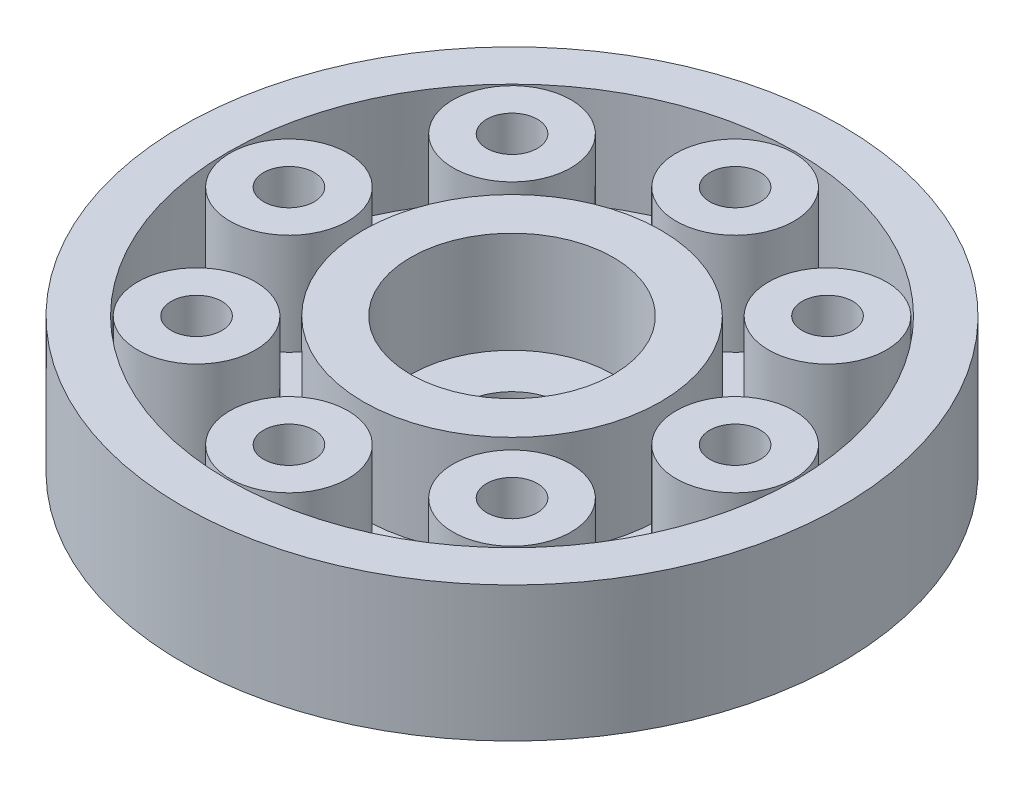
ISO-10303-21;
HEADER;
FILE_DESCRIPTION(('STEP AP214'),'2;1');
FILE_NAME('part.step','',(''),(''),'','','');
FILE_SCHEMA(('AUTOMOTIVE_DESIGN { 1 0 10303 214 1 1 1 1 }'));
ENDSEC;
DATA;
#1=APPLICATION_CONTEXT('core data for automotive mechanical design processes');
#2=APPLICATION_PROTOCOL_DEFINITION('international standard','automotive_design',2000,#1);
#3=PRODUCT_CONTEXT('',#1,'mechanical');
#4=PRODUCT('Part','Part','',(#3));
#5=PRODUCT_RELATED_PRODUCT_CATEGORY('part','',(#4));
#6=PRODUCT_DEFINITION_FORMATION('','',#4);
#7=PRODUCT_DEFINITION_CONTEXT('part definition',#1,'design');
#8=PRODUCT_DEFINITION('design','',#6,#7);
#9=PRODUCT_DEFINITION_SHAPE('','',#8);
#10=(LENGTH_UNIT() NAMED_UNIT(*) SI_UNIT(.MILLI.,.METRE.));
#11=(NAMED_UNIT(*) PLANE_ANGLE_UNIT() SI_UNIT($,.RADIAN.));
#12=(NAMED_UNIT(*) SI_UNIT($,.STERADIAN.) SOLID_ANGLE_UNIT());
#13=UNCERTAINTY_MEASURE_WITH_UNIT(LENGTH_MEASURE(1.E-05),#10,'distance_accuracy_value','');
#14=(GEOMETRIC_REPRESENTATION_CONTEXT(3) GLOBAL_UNCERTAINTY_ASSIGNED_CONTEXT((#13)) GLOBAL_UNIT_ASSIGNED_CONTEXT((#10,
#11,#12)) REPRESENTATION_CONTEXT('',''));
#15=CARTESIAN_POINT('',(0.,0.,0.));
#16=DIRECTION('',(0.,0.,1.));
#17=DIRECTION('',(1.,0.,0.));
#18=AXIS2_PLACEMENT_3D('',#15,#16,#17);
#19=CARTESIAN_POINT('',(0.394660743405106,3.,0.591991115107673));
#20=DIRECTION('',(0.,1.,0.));
#21=DIRECTION('',(0.,0.,1.));
#22=AXIS2_PLACEMENT_3D('',#19,#20,#21);
#23=PLANE('',#22);
#24=CARTESIAN_POINT('',(0.394660743405106,3.,0.591991115107673));
#25=DIRECTION('',(0.,1.,0.));
#26=DIRECTION('',(0.,0.,1.));
#27=AXIS2_PLACEMENT_3D('',#24,#25,#26);
#28=CIRCLE('',#27,4.4);
#29=CARTESIAN_POINT('',(0.394660743405106,3.,4.99199111510767));
#30=VERTEX_POINT('',#29);
#31=EDGE_CURVE('E54',#30,#30,#28,.T.);
#32=ORIENTED_EDGE('',*,*,#31,.T.);
#33=EDGE_LOOP('',(#32));
#34=FACE_BOUND('',#33,.T.);
#35=CARTESIAN_POINT('',(0.394660743405106,3.,0.591991115107673));
#36=DIRECTION('',(0.,1.,0.));
#37=DIRECTION('',(0.,0.,1.));
#38=AXIS2_PLACEMENT_3D('',#35,#36,#37);
#39=CIRCLE('',#38,3.);
#40=CARTESIAN_POINT('',(0.394660743405106,3.,3.59199111510767));
#41=VERTEX_POINT('',#40);
#42=EDGE_CURVE('E99',#41,#41,#39,.T.);
#43=ORIENTED_EDGE('',*,*,#42,.F.);
#44=EDGE_LOOP('',(#43));
#45=FACE_BOUND('',#44,.T.);
#46=ADVANCED_FACE('F38',(#34,#45),#23,.T.);
#47=CARTESIAN_POINT('',(0.394660743405106,3.,0.591991115107673));
#48=DIRECTION('',(0.,1.,0.));
#49=DIRECTION('',(0.,0.,1.));
#50=AXIS2_PLACEMENT_3D('',#47,#48,#49);
#51=CIRCLE('',#50,8.4);
#52=CARTESIAN_POINT('',(0.394660743405106,3.,8.99199111510768));
#53=VERTEX_POINT('',#52);
#54=EDGE_CURVE('E42',#53,#53,#51,.T.);
#55=ORIENTED_EDGE('',*,*,#54,.F.);
#56=EDGE_LOOP('',(#55));
#57=FACE_BOUND('',#56,.T.);
#58=CARTESIAN_POINT('',(0.394660743405106,3.,0.591991115107673));
#59=DIRECTION('',(0.,1.,0.));
#60=DIRECTION('',(0.,0.,1.));
#61=AXIS2_PLACEMENT_3D('',#58,#59,#60);
#62=CIRCLE('',#61,9.75);
#63=CARTESIAN_POINT('',(0.394660743405106,3.,10.3419911151077));
#64=VERTEX_POINT('',#63);
#65=EDGE_CURVE('E10',#64,#64,#62,.T.);
#66=ORIENTED_EDGE('',*,*,#65,.T.);
#67=EDGE_LOOP('',(#66));
#68=FACE_BOUND('',#67,.T.);
#69=ADVANCED_FACE('F88',(#57,#68),#23,.T.);
#70=CARTESIAN_POINT('',(0.394660743405106,3.,0.591991115107673));
#71=DIRECTION('',(0.,-1.,0.));
#72=DIRECTION('',(0.,0.,-1.));
#73=AXIS2_PLACEMENT_3D('',#70,#71,#72);
#74=CYLINDRICAL_SURFACE('',#73,9.75);
#75=ORIENTED_EDGE('',*,*,#65,.F.);
#76=EDGE_LOOP('',(#75));
#77=FACE_BOUND('',#76,.T.);
#78=CARTESIAN_POINT('',(0.394660743405106,-1.,0.591991115107673));
#79=DIRECTION('',(0.,-1.,0.));
#80=DIRECTION('',(0.,0.,-1.));
#81=AXIS2_PLACEMENT_3D('',#78,#79,#80);
#82=CIRCLE('',#81,9.75);
#83=CARTESIAN_POINT('',(0.394660743405106,-1.,-9.15800888489233));
#84=VERTEX_POINT('',#83);
#85=EDGE_CURVE('E46',#84,#84,#82,.T.);
#86=ORIENTED_EDGE('',*,*,#85,.F.);
#87=EDGE_LOOP('',(#86));
#88=FACE_BOUND('',#87,.T.);
#89=ADVANCED_FACE('F40',(#77,#88),#74,.T.);
#90=CARTESIAN_POINT('',(0.394660743405106,0.,0.591991115107673));
#91=DIRECTION('',(0.,-1.,0.));
#92=DIRECTION('',(0.,0.,-1.));
#93=AXIS2_PLACEMENT_3D('',#90,#91,#92);
#94=PLANE('',#93);
#95=CARTESIAN_POINT('',(0.394660743405106,0.,0.591991115107673));
#96=DIRECTION('',(0.,1.,0.));
#97=DIRECTION('',(0.,0.,1.));
#98=AXIS2_PLACEMENT_3D('',#95,#96,#97);
#99=CIRCLE('',#98,3.);
#100=CARTESIAN_POINT('',(0.394660743405106,0.,3.59199111510767));
#101=VERTEX_POINT('',#100);
#102=EDGE_CURVE('E102',#101,#101,#99,.T.);
#103=ORIENTED_EDGE('',*,*,#102,.T.);
#104=EDGE_LOOP('',(#103));
#105=FACE_BOUND('',#104,.T.);
#106=CARTESIAN_POINT('',(0.394660743405106,0.,0.591991115107673));
#107=DIRECTION('',(0.,1.,0.));
#108=DIRECTION('',(0.,0.,1.));
#109=AXIS2_PLACEMENT_3D('',#106,#107,#108);
#110=CIRCLE('',#109,1.5);
#111=CARTESIAN_POINT('',(0.394660743405106,0.,2.09199111510767));
#112=VERTEX_POINT('',#111);
#113=EDGE_CURVE('E60',#112,#112,#110,.T.);
#114=ORIENTED_EDGE('',*,*,#113,.F.);
#115=EDGE_LOOP('',(#114));
#116=FACE_BOUND('',#115,.T.);
#117=ADVANCED_FACE('F77',(#105,#116),#94,.F.);
#118=CARTESIAN_POINT('',(0.394660743405106,-1.,0.591991115107673));
#119=DIRECTION('',(0.,-1.,0.));
#120=DIRECTION('',(0.,0.,-1.));
#121=AXIS2_PLACEMENT_3D('',#118,#119,#120);
#122=PLANE('',#121);
#123=CARTESIAN_POINT('',(5.06156549923621,-1.,-4.07491364072347));
#124=DIRECTION('',(0.,-1.,0.));
#125=DIRECTION('',(0.,0.,-1.));
#126=AXIS2_PLACEMENT_3D('',#123,#124,#125);
#127=CIRCLE('',#126,0.749999999999999);
#128=CARTESIAN_POINT('',(5.06156549923621,-1.,-4.82491364072347));
#129=VERTEX_POINT('',#128);
#130=EDGE_CURVE('E101',#129,#129,#127,.T.);
#131=ORIENTED_EDGE('',*,*,#130,.F.);
#132=EDGE_LOOP('',(#131));
#133=FACE_BOUND('',#132,.T.);
#134=CARTESIAN_POINT('',(6.99466074340492,-1.,0.591991115107791));
#135=DIRECTION('',(0.,-1.,0.));
#136=DIRECTION('',(0.,0.,-1.));
#137=AXIS2_PLACEMENT_3D('',#134,#135,#136);
#138=CIRCLE('',#137,0.75);
#139=CARTESIAN_POINT('',(6.99466074340492,-1.,-0.158008884892209));
#140=VERTEX_POINT('',#139);
#141=EDGE_CURVE('E105',#140,#140,#138,.T.);
#142=ORIENTED_EDGE('',*,*,#141,.F.);
#143=EDGE_LOOP('',(#142));
#144=FACE_BOUND('',#143,.T.);
#145=CARTESIAN_POINT('',(5.06156549923604,-1.,5.25889587093898));
#146=DIRECTION('',(0.,-1.,0.));
#147=DIRECTION('',(0.,0.,-1.));
#148=AXIS2_PLACEMENT_3D('',#145,#146,#147);
#149=CIRCLE('',#148,0.75);
#150=CARTESIAN_POINT('',(5.06156549923604,-1.,4.50889587093898));
#151=VERTEX_POINT('',#150);
#152=EDGE_CURVE('E111',#151,#151,#149,.T.);
#153=ORIENTED_EDGE('',*,*,#152,.F.);
#154=EDGE_LOOP('',(#153));
#155=FACE_BOUND('',#154,.T.);
#156=CARTESIAN_POINT('',(0.39466074340478,-1.,7.19199111510767));
#157=DIRECTION('',(0.,-1.,0.));
#158=DIRECTION('',(0.,0.,-1.));
#159=AXIS2_PLACEMENT_3D('',#156,#157,#158);
#160=CIRCLE('',#159,0.75);
#161=CARTESIAN_POINT('',(0.39466074340478,-1.,6.44199111510767));
#162=VERTEX_POINT('',#161);
#163=EDGE_CURVE('E114',#162,#162,#160,.T.);
#164=ORIENTED_EDGE('',*,*,#163,.F.);
#165=EDGE_LOOP('',(#164));
#166=FACE_BOUND('',#165,.T.);
#167=CARTESIAN_POINT('',(-4.2722440124264,-1.,5.25889587093878));
#168=DIRECTION('',(0.,-1.,0.));
#169=DIRECTION('',(0.,0.,-1.));
#170=AXIS2_PLACEMENT_3D('',#167,#168,#169);
#171=CIRCLE('',#170,0.75);
#172=CARTESIAN_POINT('',(-4.2722440124264,-1.,4.50889587093878));
#173=VERTEX_POINT('',#172);
#174=EDGE_CURVE('E117',#173,#173,#171,.T.);
#175=ORIENTED_EDGE('',*,*,#174,.F.);
#176=EDGE_LOOP('',(#175));
#177=FACE_BOUND('',#176,.T.);
#178=CARTESIAN_POINT('',(-6.20533925659508,-1.,0.59199111510751));
#179=DIRECTION('',(0.,-1.,0.));
#180=DIRECTION('',(0.,0.,-1.));
#181=AXIS2_PLACEMENT_3D('',#178,#179,#180);
#182=CIRCLE('',#181,0.75);
#183=CARTESIAN_POINT('',(-6.20533925659508,-1.,-0.15800888489249));
#184=VERTEX_POINT('',#183);
#185=EDGE_CURVE('E120',#184,#184,#182,.T.);
#186=ORIENTED_EDGE('',*,*,#185,.F.);
#187=EDGE_LOOP('',(#186));
#188=FACE_BOUND('',#187,.T.);
#189=CARTESIAN_POINT('',(-4.27224401242617,-1.,-4.07491364072366));
#190=DIRECTION('',(0.,-1.,0.));
#191=DIRECTION('',(0.,0.,-1.));
#192=AXIS2_PLACEMENT_3D('',#189,#190,#191);
#193=CIRCLE('',#192,0.749999999999999);
#194=CARTESIAN_POINT('',(-4.27224401242617,-1.,-4.82491364072366));
#195=VERTEX_POINT('',#194);
#196=EDGE_CURVE('E123',#195,#195,#193,.T.);
#197=ORIENTED_EDGE('',*,*,#196,.F.);
#198=EDGE_LOOP('',(#197));
#199=FACE_BOUND('',#198,.T.);
#200=CARTESIAN_POINT('',(0.394660743405106,-1.,-6.00800888489233));
#201=DIRECTION('',(0.,-1.,0.));
#202=DIRECTION('',(0.,0.,-1.));
#203=AXIS2_PLACEMENT_3D('',#200,#201,#202);
#204=CIRCLE('',#203,0.75);
#205=CARTESIAN_POINT('',(0.394660743405106,-1.,-6.75800888489233));
#206=VERTEX_POINT('',#205);
#207=EDGE_CURVE('E126',#206,#206,#204,.T.);
#208=ORIENTED_EDGE('',*,*,#207,.F.);
#209=EDGE_LOOP('',(#208));
#210=FACE_BOUND('',#209,.T.);
#211=CARTESIAN_POINT('',(0.394660743405106,-1.,0.591991115107673));
#212=DIRECTION('',(0.,1.,0.));
#213=DIRECTION('',(0.,0.,1.));
#214=AXIS2_PLACEMENT_3D('',#211,#212,#213);
#215=CIRCLE('',#214,1.5);
#216=CARTESIAN_POINT('',(0.394660743405106,-1.,2.09199111510767));
#217=VERTEX_POINT('',#216);
#218=EDGE_CURVE('E51',#217,#217,#215,.T.);
#219=ORIENTED_EDGE('',*,*,#218,.T.);
#220=EDGE_LOOP('',(#219));
#221=FACE_BOUND('',#220,.T.);
#222=ORIENTED_EDGE('',*,*,#85,.T.);
#223=EDGE_LOOP('',(#222));
#224=FACE_BOUND('',#223,.T.);
#225=ADVANCED_FACE('F79',(#133,#144,#155,#166,#177,#188,#199,#210,#221,#224),#122,.T.);
#226=CARTESIAN_POINT('',(0.394660743405106,-1.,0.591991115107673));
#227=DIRECTION('',(0.,1.,0.));
#228=DIRECTION('',(0.,0.,1.));
#229=AXIS2_PLACEMENT_3D('',#226,#227,#228);
#230=CYLINDRICAL_SURFACE('',#229,1.5);
#231=ORIENTED_EDGE('',*,*,#218,.F.);
#232=EDGE_LOOP('',(#231));
#233=FACE_BOUND('',#232,.T.);
#234=ORIENTED_EDGE('',*,*,#113,.T.);
#235=EDGE_LOOP('',(#234));
#236=FACE_BOUND('',#235,.T.);
#237=ADVANCED_FACE('F75',(#233,#236),#230,.F.);
#238=CARTESIAN_POINT('',(0.394660743405106,10.,0.591991115107673));
#239=DIRECTION('',(0.,-1.,0.));
#240=DIRECTION('',(0.,0.,-1.));
#241=AXIS2_PLACEMENT_3D('',#238,#239,#240);
#242=CYLINDRICAL_SURFACE('',#241,8.4);
#243=ORIENTED_EDGE('',*,*,#54,.T.);
#244=EDGE_LOOP('',(#243));
#245=FACE_BOUND('',#244,.T.);
#246=CARTESIAN_POINT('',(0.394660743405106,0.,0.591991115107673));
#247=DIRECTION('',(0.,-1.,0.));
#248=DIRECTION('',(0.,0.,-1.));
#249=AXIS2_PLACEMENT_3D('',#246,#247,#248);
#250=CIRCLE('',#249,8.4);
#251=CARTESIAN_POINT('',(0.394660743405106,0.,-7.80800888489233));
#252=VERTEX_POINT('',#251);
#253=EDGE_CURVE('E56',#252,#252,#250,.T.);
#254=ORIENTED_EDGE('',*,*,#253,.T.);
#255=EDGE_LOOP('',(#254));
#256=FACE_BOUND('',#255,.T.);
#257=ADVANCED_FACE('F222',(#245,#256),#242,.F.);
#258=CARTESIAN_POINT('',(0.394660743405106,0.,0.591991115107673));
#259=DIRECTION('',(0.,-1.,0.));
#260=DIRECTION('',(0.,0.,-1.));
#261=AXIS2_PLACEMENT_3D('',#258,#259,#260);
#262=PLANE('',#261);
#263=CARTESIAN_POINT('',(5.06156549923621,0.,-4.07491364072347));
#264=DIRECTION('',(0.,-1.,0.));
#265=DIRECTION('',(0.,0.,-1.));
#266=AXIS2_PLACEMENT_3D('',#263,#264,#265);
#267=CIRCLE('',#266,1.7444823620493);
#268=CARTESIAN_POINT('',(5.06156549923621,0.,-5.81939600277277));
#269=VERTEX_POINT('',#268);
#270=EDGE_CURVE('E132',#269,#269,#267,.T.);
#271=ORIENTED_EDGE('',*,*,#270,.T.);
#272=EDGE_LOOP('',(#271));
#273=FACE_BOUND('',#272,.T.);
#274=CARTESIAN_POINT('',(6.99466074340492,0.,0.591991115107791));
#275=DIRECTION('',(0.,-1.,0.));
#276=DIRECTION('',(0.,0.,-1.));
#277=AXIS2_PLACEMENT_3D('',#274,#275,#276);
#278=CIRCLE('',#277,1.7444823620493);
#279=CARTESIAN_POINT('',(6.99466074340492,0.,-1.15249124694151));
#280=VERTEX_POINT('',#279);
#281=EDGE_CURVE('E141',#280,#280,#278,.T.);
#282=ORIENTED_EDGE('',*,*,#281,.T.);
#283=EDGE_LOOP('',(#282));
#284=FACE_BOUND('',#283,.T.);
#285=CARTESIAN_POINT('',(5.06156549923604,0.,5.25889587093898));
#286=DIRECTION('',(0.,-1.,0.));
#287=DIRECTION('',(0.,0.,-1.));
#288=AXIS2_PLACEMENT_3D('',#285,#286,#287);
#289=CIRCLE('',#288,1.7444823620493);
#290=CARTESIAN_POINT('',(5.06156549923604,0.,3.51441350888968));
#291=VERTEX_POINT('',#290);
#292=EDGE_CURVE('E150',#291,#291,#289,.T.);
#293=ORIENTED_EDGE('',*,*,#292,.T.);
#294=EDGE_LOOP('',(#293));
#295=FACE_BOUND('',#294,.T.);
#296=CARTESIAN_POINT('',(0.39466074340478,0.,7.19199111510767));
#297=DIRECTION('',(0.,-1.,0.));
#298=DIRECTION('',(0.,0.,-1.));
#299=AXIS2_PLACEMENT_3D('',#296,#297,#298);
#300=CIRCLE('',#299,1.7444823620493);
#301=CARTESIAN_POINT('',(0.39466074340478,0.,5.44750875305837));
#302=VERTEX_POINT('',#301);
#303=EDGE_CURVE('E159',#302,#302,#300,.T.);
#304=ORIENTED_EDGE('',*,*,#303,.T.);
#305=EDGE_LOOP('',(#304));
#306=FACE_BOUND('',#305,.T.);
#307=CARTESIAN_POINT('',(-4.2722440124264,0.,5.25889587093878));
#308=DIRECTION('',(0.,-1.,0.));
#309=DIRECTION('',(0.,0.,-1.));
#310=AXIS2_PLACEMENT_3D('',#307,#308,#309);
#311=CIRCLE('',#310,1.7444823620493);
#312=CARTESIAN_POINT('',(-4.2722440124264,0.,3.51441350888948));
#313=VERTEX_POINT('',#312);
#314=EDGE_CURVE('E168',#313,#313,#311,.T.);
#315=ORIENTED_EDGE('',*,*,#314,.T.);
#316=EDGE_LOOP('',(#315));
#317=FACE_BOUND('',#316,.T.);
#318=CARTESIAN_POINT('',(-6.20533925659508,0.,0.59199111510751));
#319=DIRECTION('',(0.,-1.,0.));
#320=DIRECTION('',(0.,0.,-1.));
#321=AXIS2_PLACEMENT_3D('',#318,#319,#320);
#322=CIRCLE('',#321,1.7444823620493);
#323=CARTESIAN_POINT('',(-6.20533925659508,0.,-1.15249124694179));
#324=VERTEX_POINT('',#323);
#325=EDGE_CURVE('E177',#324,#324,#322,.T.);
#326=ORIENTED_EDGE('',*,*,#325,.T.);
#327=EDGE_LOOP('',(#326));
#328=FACE_BOUND('',#327,.T.);
#329=CARTESIAN_POINT('',(-4.27224401242617,0.,-4.07491364072366));
#330=DIRECTION('',(0.,-1.,0.));
#331=DIRECTION('',(0.,0.,-1.));
#332=AXIS2_PLACEMENT_3D('',#329,#330,#331);
#333=CIRCLE('',#332,1.7444823620493);
#334=CARTESIAN_POINT('',(-4.27224401242617,0.,-5.81939600277296));
#335=VERTEX_POINT('',#334);
#336=EDGE_CURVE('E186',#335,#335,#333,.T.);
#337=ORIENTED_EDGE('',*,*,#336,.T.);
#338=EDGE_LOOP('',(#337));
#339=FACE_BOUND('',#338,.T.);
#340=CARTESIAN_POINT('',(0.394660743405106,0.,-6.00800888489233));
#341=DIRECTION('',(0.,-1.,0.));
#342=DIRECTION('',(0.,0.,-1.));
#343=AXIS2_PLACEMENT_3D('',#340,#341,#342);
#344=CIRCLE('',#343,1.7444823620493);
#345=CARTESIAN_POINT('',(0.394660743405106,0.,-7.75249124694163));
#346=VERTEX_POINT('',#345);
#347=EDGE_CURVE('E195',#346,#346,#344,.T.);
#348=ORIENTED_EDGE('',*,*,#347,.T.);
#349=EDGE_LOOP('',(#348));
#350=FACE_BOUND('',#349,.T.);
#351=CARTESIAN_POINT('',(0.394660743405106,0.,0.591991115107673));
#352=DIRECTION('',(0.,-1.,0.));
#353=DIRECTION('',(0.,0.,-1.));
#354=AXIS2_PLACEMENT_3D('',#351,#352,#353);
#355=CIRCLE('',#354,4.4);
#356=CARTESIAN_POINT('',(0.394660743405106,0.,-3.80800888489233));
#357=VERTEX_POINT('',#356);
#358=EDGE_CURVE('E62',#357,#357,#355,.T.);
#359=ORIENTED_EDGE('',*,*,#358,.T.);
#360=EDGE_LOOP('',(#359));
#361=FACE_BOUND('',#360,.T.);
#362=ORIENTED_EDGE('',*,*,#253,.F.);
#363=EDGE_LOOP('',(#362));
#364=FACE_BOUND('',#363,.T.);
#365=ADVANCED_FACE('F200',(#273,#284,#295,#306,#317,#328,#339,#350,#361,#364),#262,.F.);
#366=CARTESIAN_POINT('',(0.394660743405106,10.,0.591991115107673));
#367=DIRECTION('',(0.,-1.,0.));
#368=DIRECTION('',(0.,0.,-1.));
#369=AXIS2_PLACEMENT_3D('',#366,#367,#368);
#370=CYLINDRICAL_SURFACE('',#369,4.4);
#371=ORIENTED_EDGE('',*,*,#31,.F.);
#372=EDGE_LOOP('',(#371));
#373=FACE_BOUND('',#372,.T.);
#374=ORIENTED_EDGE('',*,*,#358,.F.);
#375=EDGE_LOOP('',(#374));
#376=FACE_BOUND('',#375,.T.);
#377=ADVANCED_FACE('F206',(#373,#376),#370,.T.);
#378=CARTESIAN_POINT('',(0.394660743405106,3.,-6.00800888489233));
#379=DIRECTION('',(0.,-1.,0.));
#380=DIRECTION('',(0.,0.,-1.));
#381=AXIS2_PLACEMENT_3D('',#378,#379,#380);
#382=CYLINDRICAL_SURFACE('',#381,1.7444823620493);
#383=CARTESIAN_POINT('',(0.394660743405106,3.,-6.00800888489233));
#384=DIRECTION('',(0.,-1.,0.));
#385=DIRECTION('',(0.,0.,-1.));
#386=AXIS2_PLACEMENT_3D('',#383,#384,#385);
#387=CIRCLE('',#386,1.7444823620493);
#388=CARTESIAN_POINT('',(0.394660743405106,3.,-7.75249124694163));
#389=VERTEX_POINT('',#388);
#390=EDGE_CURVE('E67',#389,#389,#387,.T.);
#391=ORIENTED_EDGE('',*,*,#390,.T.);
#392=EDGE_LOOP('',(#391));
#393=FACE_BOUND('',#392,.T.);
#394=ORIENTED_EDGE('',*,*,#347,.F.);
#395=EDGE_LOOP('',(#394));
#396=FACE_BOUND('',#395,.T.);
#397=ADVANCED_FACE('F203',(#393,#396),#382,.T.);
#398=CARTESIAN_POINT('',(0.394660743405106,3.,-6.00800888489233));
#399=DIRECTION('',(0.,-1.,0.));
#400=DIRECTION('',(0.,0.,-1.));
#401=AXIS2_PLACEMENT_3D('',#398,#399,#400);
#402=PLANE('',#401);
#403=CARTESIAN_POINT('',(0.394660743405106,3.,-6.00800888489233));
#404=DIRECTION('',(0.,-1.,0.));
#405=DIRECTION('',(0.,0.,-1.));
#406=AXIS2_PLACEMENT_3D('',#403,#404,#405);
#407=CIRCLE('',#406,0.75);
#408=CARTESIAN_POINT('',(0.394660743405106,3.,-6.75800888489233));
#409=VERTEX_POINT('',#408);
#410=EDGE_CURVE('E190',#409,#409,#407,.T.);
#411=ORIENTED_EDGE('',*,*,#410,.T.);
#412=EDGE_LOOP('',(#411));
#413=FACE_BOUND('',#412,.T.);
#414=ORIENTED_EDGE('',*,*,#390,.F.);
#415=EDGE_LOOP('',(#414));
#416=FACE_BOUND('',#415,.T.);
#417=ADVANCED_FACE('F205',(#413,#416),#402,.F.);
#418=CARTESIAN_POINT('',(0.394660743405106,3.,-6.00800888489233));
#419=DIRECTION('',(0.,-1.,0.));
#420=DIRECTION('',(0.,0.,-1.));
#421=AXIS2_PLACEMENT_3D('',#418,#419,#420);
#422=CYLINDRICAL_SURFACE('',#421,0.75);
#423=ORIENTED_EDGE('',*,*,#207,.T.);
#424=EDGE_LOOP('',(#423));
#425=FACE_BOUND('',#424,.T.);
#426=ORIENTED_EDGE('',*,*,#410,.F.);
#427=EDGE_LOOP('',(#426));
#428=FACE_BOUND('',#427,.T.);
#429=ADVANCED_FACE('F213',(#425,#428),#422,.F.);
#430=CARTESIAN_POINT('',(-4.27224401242617,3.,-4.07491364072366));
#431=DIRECTION('',(0.,-1.,0.));
#432=DIRECTION('',(0.,0.,-1.));
#433=AXIS2_PLACEMENT_3D('',#430,#431,#432);
#434=CYLINDRICAL_SURFACE('',#433,1.7444823620493);
#435=CARTESIAN_POINT('',(-4.27224401242617,3.,-4.07491364072366));
#436=DIRECTION('',(0.,-1.,0.));
#437=DIRECTION('',(0.,0.,-1.));
#438=AXIS2_PLACEMENT_3D('',#435,#436,#437);
#439=CIRCLE('',#438,1.7444823620493);
#440=CARTESIAN_POINT('',(-4.27224401242617,3.,-5.81939600277296));
#441=VERTEX_POINT('',#440);
#442=EDGE_CURVE('E187',#441,#441,#439,.T.);
#443=ORIENTED_EDGE('',*,*,#442,.T.);
#444=EDGE_LOOP('',(#443));
#445=FACE_BOUND('',#444,.T.);
#446=ORIENTED_EDGE('',*,*,#336,.F.);
#447=EDGE_LOOP('',(#446));
#448=FACE_BOUND('',#447,.T.);
#449=ADVANCED_FACE('F274',(#445,#448),#434,.T.);
#450=CARTESIAN_POINT('',(-4.27224401242617,3.,-4.07491364072366));
#451=DIRECTION('',(0.,-1.,0.));
#452=DIRECTION('',(0.,0.,-1.));
#453=AXIS2_PLACEMENT_3D('',#450,#451,#452);
#454=PLANE('',#453);
#455=CARTESIAN_POINT('',(-4.27224401242616,3.,-4.07491364072367));
#456=DIRECTION('',(0.,-1.,0.));
#457=DIRECTION('',(0.,0.,-1.));
#458=AXIS2_PLACEMENT_3D('',#455,#456,#457);
#459=CIRCLE('',#458,0.750000000000001);
#460=CARTESIAN_POINT('',(-4.27224401242616,3.,-4.82491364072368));
#461=VERTEX_POINT('',#460);
#462=EDGE_CURVE('E181',#461,#461,#459,.T.);
#463=ORIENTED_EDGE('',*,*,#462,.T.);
#464=EDGE_LOOP('',(#463));
#465=FACE_BOUND('',#464,.T.);
#466=ORIENTED_EDGE('',*,*,#442,.F.);
#467=EDGE_LOOP('',(#466));
#468=FACE_BOUND('',#467,.T.);
#469=ADVANCED_FACE('F285',(#465,#468),#454,.F.);
#470=CARTESIAN_POINT('',(-4.27224401242616,3.,-4.07491364072367));
#471=DIRECTION('',(0.,-1.,0.));
#472=DIRECTION('',(0.,0.,-1.));
#473=AXIS2_PLACEMENT_3D('',#470,#471,#472);
#474=CYLINDRICAL_SURFACE('',#473,0.750000000000001);
#475=ORIENTED_EDGE('',*,*,#196,.T.);
#476=EDGE_LOOP('',(#475));
#477=FACE_BOUND('',#476,.T.);
#478=ORIENTED_EDGE('',*,*,#462,.F.);
#479=EDGE_LOOP('',(#478));
#480=FACE_BOUND('',#479,.T.);
#481=ADVANCED_FACE('F294',(#477,#480),#474,.F.);
#482=CARTESIAN_POINT('',(-6.20533925659508,3.,0.59199111510751));
#483=DIRECTION('',(0.,-1.,0.));
#484=DIRECTION('',(0.,0.,-1.));
#485=AXIS2_PLACEMENT_3D('',#482,#483,#484);
#486=CYLINDRICAL_SURFACE('',#485,1.7444823620493);
#487=CARTESIAN_POINT('',(-6.20533925659508,3.,0.59199111510751));
#488=DIRECTION('',(0.,-1.,0.));
#489=DIRECTION('',(0.,0.,-1.));
#490=AXIS2_PLACEMENT_3D('',#487,#488,#489);
#491=CIRCLE('',#490,1.7444823620493);
#492=CARTESIAN_POINT('',(-6.20533925659508,3.,-1.15249124694179));
#493=VERTEX_POINT('',#492);
#494=EDGE_CURVE('E178',#493,#493,#491,.T.);
#495=ORIENTED_EDGE('',*,*,#494,.T.);
#496=EDGE_LOOP('',(#495));
#497=FACE_BOUND('',#496,.T.);
#498=ORIENTED_EDGE('',*,*,#325,.F.);
#499=EDGE_LOOP('',(#498));
#500=FACE_BOUND('',#499,.T.);
#501=ADVANCED_FACE('F303',(#497,#500),#486,.T.);
#502=CARTESIAN_POINT('',(-6.20533925659508,3.,0.59199111510751));
#503=DIRECTION('',(0.,-1.,0.));
#504=DIRECTION('',(0.,0.,-1.));
#505=AXIS2_PLACEMENT_3D('',#502,#503,#504);
#506=PLANE('',#505);
#507=CARTESIAN_POINT('',(-6.20533925659508,3.,0.591991115107482));
#508=DIRECTION('',(0.,-1.,0.));
#509=DIRECTION('',(0.,0.,-1.));
#510=AXIS2_PLACEMENT_3D('',#507,#508,#509);
#511=CIRCLE('',#510,0.75);
#512=CARTESIAN_POINT('',(-6.20533925659508,3.,-0.158008884892518));
#513=VERTEX_POINT('',#512);
#514=EDGE_CURVE('E172',#513,#513,#511,.T.);
#515=ORIENTED_EDGE('',*,*,#514,.T.);
#516=EDGE_LOOP('',(#515));
#517=FACE_BOUND('',#516,.T.);
#518=ORIENTED_EDGE('',*,*,#494,.F.);
#519=EDGE_LOOP('',(#518));
#520=FACE_BOUND('',#519,.T.);
#521=ADVANCED_FACE('F314',(#517,#520),#506,.F.);
#522=CARTESIAN_POINT('',(-6.20533925659508,3.,0.591991115107482));
#523=DIRECTION('',(0.,-1.,0.));
#524=DIRECTION('',(0.,0.,-1.));
#525=AXIS2_PLACEMENT_3D('',#522,#523,#524);
#526=CYLINDRICAL_SURFACE('',#525,0.75);
#527=ORIENTED_EDGE('',*,*,#185,.T.);
#528=EDGE_LOOP('',(#527));
#529=FACE_BOUND('',#528,.T.);
#530=ORIENTED_EDGE('',*,*,#514,.F.);
#531=EDGE_LOOP('',(#530));
#532=FACE_BOUND('',#531,.T.);
#533=ADVANCED_FACE('F323',(#529,#532),#526,.F.);
#534=CARTESIAN_POINT('',(-4.2722440124264,3.,5.25889587093878));
#535=DIRECTION('',(0.,-1.,0.));
#536=DIRECTION('',(0.,0.,-1.));
#537=AXIS2_PLACEMENT_3D('',#534,#535,#536);
#538=CYLINDRICAL_SURFACE('',#537,1.7444823620493);
#539=CARTESIAN_POINT('',(-4.2722440124264,3.,5.25889587093878));
#540=DIRECTION('',(0.,-1.,0.));
#541=DIRECTION('',(0.,0.,-1.));
#542=AXIS2_PLACEMENT_3D('',#539,#540,#541);
#543=CIRCLE('',#542,1.7444823620493);
#544=CARTESIAN_POINT('',(-4.2722440124264,3.,3.51441350888948));
#545=VERTEX_POINT('',#544);
#546=EDGE_CURVE('E169',#545,#545,#543,.T.);
#547=ORIENTED_EDGE('',*,*,#546,.T.);
#548=EDGE_LOOP('',(#547));
#549=FACE_BOUND('',#548,.T.);
#550=ORIENTED_EDGE('',*,*,#314,.F.);
#551=EDGE_LOOP('',(#550));
#552=FACE_BOUND('',#551,.T.);
#553=ADVANCED_FACE('F332',(#549,#552),#538,.T.);
#554=CARTESIAN_POINT('',(-4.2722440124264,3.,5.25889587093878));
#555=DIRECTION('',(0.,-1.,0.));
#556=DIRECTION('',(0.,0.,-1.));
#557=AXIS2_PLACEMENT_3D('',#554,#555,#556);
#558=PLANE('',#557);
#559=CARTESIAN_POINT('',(-4.27224401242643,3.,5.25889587093875));
#560=DIRECTION('',(0.,-1.,0.));
#561=DIRECTION('',(0.,0.,-1.));
#562=AXIS2_PLACEMENT_3D('',#559,#560,#561);
#563=CIRCLE('',#562,0.75);
#564=CARTESIAN_POINT('',(-4.27224401242643,3.,4.50889587093875));
#565=VERTEX_POINT('',#564);
#566=EDGE_CURVE('E163',#565,#565,#563,.T.);
#567=ORIENTED_EDGE('',*,*,#566,.T.);
#568=EDGE_LOOP('',(#567));
#569=FACE_BOUND('',#568,.T.);
#570=ORIENTED_EDGE('',*,*,#546,.F.);
#571=EDGE_LOOP('',(#570));
#572=FACE_BOUND('',#571,.T.);
#573=ADVANCED_FACE('F343',(#569,#572),#558,.F.);
#574=CARTESIAN_POINT('',(-4.27224401242643,3.,5.25889587093875));
#575=DIRECTION('',(0.,-1.,0.));
#576=DIRECTION('',(0.,0.,-1.));
#577=AXIS2_PLACEMENT_3D('',#574,#575,#576);
#578=CYLINDRICAL_SURFACE('',#577,0.75);
#579=ORIENTED_EDGE('',*,*,#174,.T.);
#580=EDGE_LOOP('',(#579));
#581=FACE_BOUND('',#580,.T.);
#582=ORIENTED_EDGE('',*,*,#566,.F.);
#583=EDGE_LOOP('',(#582));
#584=FACE_BOUND('',#583,.T.);
#585=ADVANCED_FACE('F352',(#581,#584),#578,.F.);
#586=CARTESIAN_POINT('',(0.39466074340478,3.,7.19199111510767));
#587=DIRECTION('',(0.,-1.,0.));
#588=DIRECTION('',(0.,0.,-1.));
#589=AXIS2_PLACEMENT_3D('',#586,#587,#588);
#590=CYLINDRICAL_SURFACE('',#589,1.7444823620493);
#591=CARTESIAN_POINT('',(0.39466074340478,3.,7.19199111510767));
#592=DIRECTION('',(0.,-1.,0.));
#593=DIRECTION('',(0.,0.,-1.));
#594=AXIS2_PLACEMENT_3D('',#591,#592,#593);
#595=CIRCLE('',#594,1.7444823620493);
#596=CARTESIAN_POINT('',(0.39466074340478,3.,5.44750875305837));
#597=VERTEX_POINT('',#596);
#598=EDGE_CURVE('E160',#597,#597,#595,.T.);
#599=ORIENTED_EDGE('',*,*,#598,.T.);
#600=EDGE_LOOP('',(#599));
#601=FACE_BOUND('',#600,.T.);
#602=ORIENTED_EDGE('',*,*,#303,.F.);
#603=EDGE_LOOP('',(#602));
#604=FACE_BOUND('',#603,.T.);
#605=ADVANCED_FACE('F361',(#601,#604),#590,.T.);
#606=CARTESIAN_POINT('',(0.39466074340478,3.,7.19199111510767));
#607=DIRECTION('',(0.,-1.,0.));
#608=DIRECTION('',(0.,0.,-1.));
#609=AXIS2_PLACEMENT_3D('',#606,#607,#608);
#610=PLANE('',#609);
#611=CARTESIAN_POINT('',(0.394660743404724,3.,7.19199111510767));
#612=DIRECTION('',(0.,-1.,0.));
#613=DIRECTION('',(0.,0.,-1.));
#614=AXIS2_PLACEMENT_3D('',#611,#612,#613);
#615=CIRCLE('',#614,0.75);
#616=CARTESIAN_POINT('',(0.394660743404724,3.,6.44199111510767));
#617=VERTEX_POINT('',#616);
#618=EDGE_CURVE('E154',#617,#617,#615,.T.);
#619=ORIENTED_EDGE('',*,*,#618,.T.);
#620=EDGE_LOOP('',(#619));
#621=FACE_BOUND('',#620,.T.);
#622=ORIENTED_EDGE('',*,*,#598,.F.);
#623=EDGE_LOOP('',(#622));
#624=FACE_BOUND('',#623,.T.);
#625=ADVANCED_FACE('F372',(#621,#624),#610,.F.);
#626=CARTESIAN_POINT('',(0.394660743404724,3.,7.19199111510767));
#627=DIRECTION('',(0.,-1.,0.));
#628=DIRECTION('',(0.,0.,-1.));
#629=AXIS2_PLACEMENT_3D('',#626,#627,#628);
#630=CYLINDRICAL_SURFACE('',#629,0.75);
#631=ORIENTED_EDGE('',*,*,#163,.T.);
#632=EDGE_LOOP('',(#631));
#633=FACE_BOUND('',#632,.T.);
#634=ORIENTED_EDGE('',*,*,#618,.F.);
#635=EDGE_LOOP('',(#634));
#636=FACE_BOUND('',#635,.T.);
#637=ADVANCED_FACE('F381',(#633,#636),#630,.F.);
#638=CARTESIAN_POINT('',(5.06156549923604,3.,5.25889587093898));
#639=DIRECTION('',(0.,-1.,0.));
#640=DIRECTION('',(0.,0.,-1.));
#641=AXIS2_PLACEMENT_3D('',#638,#639,#640);
#642=CYLINDRICAL_SURFACE('',#641,1.7444823620493);
#643=CARTESIAN_POINT('',(5.06156549923604,3.,5.25889587093898));
#644=DIRECTION('',(0.,-1.,0.));
#645=DIRECTION('',(0.,0.,-1.));
#646=AXIS2_PLACEMENT_3D('',#643,#644,#645);
#647=CIRCLE('',#646,1.7444823620493);
#648=CARTESIAN_POINT('',(5.06156549923604,3.,3.51441350888968));
#649=VERTEX_POINT('',#648);
#650=EDGE_CURVE('E151',#649,#649,#647,.T.);
#651=ORIENTED_EDGE('',*,*,#650,.T.);
#652=EDGE_LOOP('',(#651));
#653=FACE_BOUND('',#652,.T.);
#654=ORIENTED_EDGE('',*,*,#292,.F.);
#655=EDGE_LOOP('',(#654));
#656=FACE_BOUND('',#655,.T.);
#657=ADVANCED_FACE('F390',(#653,#656),#642,.T.);
#658=CARTESIAN_POINT('',(5.06156549923604,3.,5.25889587093898));
#659=DIRECTION('',(0.,-1.,0.));
#660=DIRECTION('',(0.,0.,-1.));
#661=AXIS2_PLACEMENT_3D('',#658,#659,#660);
#662=PLANE('',#661);
#663=CARTESIAN_POINT('',(5.06156549923599,3.,5.25889587093902));
#664=DIRECTION('',(0.,-1.,0.));
#665=DIRECTION('',(0.,0.,-1.));
#666=AXIS2_PLACEMENT_3D('',#663,#664,#665);
#667=CIRCLE('',#666,0.750000000000001);
#668=CARTESIAN_POINT('',(5.06156549923599,3.,4.50889587093902));
#669=VERTEX_POINT('',#668);
#670=EDGE_CURVE('E145',#669,#669,#667,.T.);
#671=ORIENTED_EDGE('',*,*,#670,.T.);
#672=EDGE_LOOP('',(#671));
#673=FACE_BOUND('',#672,.T.);
#674=ORIENTED_EDGE('',*,*,#650,.F.);
#675=EDGE_LOOP('',(#674));
#676=FACE_BOUND('',#675,.T.);
#677=ADVANCED_FACE('F401',(#673,#676),#662,.F.);
#678=CARTESIAN_POINT('',(5.06156549923599,3.,5.25889587093902));
#679=DIRECTION('',(0.,-1.,0.));
#680=DIRECTION('',(0.,0.,-1.));
#681=AXIS2_PLACEMENT_3D('',#678,#679,#680);
#682=CYLINDRICAL_SURFACE('',#681,0.750000000000001);
#683=ORIENTED_EDGE('',*,*,#152,.T.);
#684=EDGE_LOOP('',(#683));
#685=FACE_BOUND('',#684,.T.);
#686=ORIENTED_EDGE('',*,*,#670,.F.);
#687=EDGE_LOOP('',(#686));
#688=FACE_BOUND('',#687,.T.);
#689=ADVANCED_FACE('F410',(#685,#688),#682,.F.);
#690=CARTESIAN_POINT('',(6.99466074340492,3.,0.591991115107791));
#691=DIRECTION('',(0.,-1.,0.));
#692=DIRECTION('',(0.,0.,-1.));
#693=AXIS2_PLACEMENT_3D('',#690,#691,#692);
#694=CYLINDRICAL_SURFACE('',#693,1.7444823620493);
#695=CARTESIAN_POINT('',(6.99466074340492,3.,0.591991115107791));
#696=DIRECTION('',(0.,-1.,0.));
#697=DIRECTION('',(0.,0.,-1.));
#698=AXIS2_PLACEMENT_3D('',#695,#696,#697);
#699=CIRCLE('',#698,1.7444823620493);
#700=CARTESIAN_POINT('',(6.99466074340492,3.,-1.15249124694151));
#701=VERTEX_POINT('',#700);
#702=EDGE_CURVE('E142',#701,#701,#699,.T.);
#703=ORIENTED_EDGE('',*,*,#702,.T.);
#704=EDGE_LOOP('',(#703));
#705=FACE_BOUND('',#704,.T.);
#706=ORIENTED_EDGE('',*,*,#281,.F.);
#707=EDGE_LOOP('',(#706));
#708=FACE_BOUND('',#707,.T.);
#709=ADVANCED_FACE('F419',(#705,#708),#694,.T.);
#710=CARTESIAN_POINT('',(6.99466074340492,3.,0.591991115107791));
#711=DIRECTION('',(0.,-1.,0.));
#712=DIRECTION('',(0.,0.,-1.));
#713=AXIS2_PLACEMENT_3D('',#710,#711,#712);
#714=PLANE('',#713);
#715=CARTESIAN_POINT('',(6.99466074340492,3.,0.591991115107865));
#716=DIRECTION('',(0.,-1.,0.));
#717=DIRECTION('',(0.,0.,-1.));
#718=AXIS2_PLACEMENT_3D('',#715,#716,#717);
#719=CIRCLE('',#718,0.75);
#720=CARTESIAN_POINT('',(6.99466074340492,3.,-0.158008884892135));
#721=VERTEX_POINT('',#720);
#722=EDGE_CURVE('E136',#721,#721,#719,.T.);
#723=ORIENTED_EDGE('',*,*,#722,.T.);
#724=EDGE_LOOP('',(#723));
#725=FACE_BOUND('',#724,.T.);
#726=ORIENTED_EDGE('',*,*,#702,.F.);
#727=EDGE_LOOP('',(#726));
#728=FACE_BOUND('',#727,.T.);
#729=ADVANCED_FACE('F430',(#725,#728),#714,.F.);
#730=CARTESIAN_POINT('',(6.99466074340492,3.,0.591991115107865));
#731=DIRECTION('',(0.,-1.,0.));
#732=DIRECTION('',(0.,0.,-1.));
#733=AXIS2_PLACEMENT_3D('',#730,#731,#732);
#734=CYLINDRICAL_SURFACE('',#733,0.75);
#735=ORIENTED_EDGE('',*,*,#141,.T.);
#736=EDGE_LOOP('',(#735));
#737=FACE_BOUND('',#736,.T.);
#738=ORIENTED_EDGE('',*,*,#722,.F.);
#739=EDGE_LOOP('',(#738));
#740=FACE_BOUND('',#739,.T.);
#741=ADVANCED_FACE('F439',(#737,#740),#734,.F.);
#742=CARTESIAN_POINT('',(5.06156549923621,3.,-4.07491364072347));
#743=DIRECTION('',(0.,-1.,0.));
#744=DIRECTION('',(0.,0.,-1.));
#745=AXIS2_PLACEMENT_3D('',#742,#743,#744);
#746=CYLINDRICAL_SURFACE('',#745,1.7444823620493);
#747=CARTESIAN_POINT('',(5.06156549923621,3.,-4.07491364072347));
#748=DIRECTION('',(0.,-1.,0.));
#749=DIRECTION('',(0.,0.,-1.));
#750=AXIS2_PLACEMENT_3D('',#747,#748,#749);
#751=CIRCLE('',#750,1.7444823620493);
#752=CARTESIAN_POINT('',(5.06156549923621,3.,-5.81939600277277));
#753=VERTEX_POINT('',#752);
#754=EDGE_CURVE('E133',#753,#753,#751,.T.);
#755=ORIENTED_EDGE('',*,*,#754,.T.);
#756=EDGE_LOOP('',(#755));
#757=FACE_BOUND('',#756,.T.);
#758=ORIENTED_EDGE('',*,*,#270,.F.);
#759=EDGE_LOOP('',(#758));
#760=FACE_BOUND('',#759,.T.);
#761=ADVANCED_FACE('F448',(#757,#760),#746,.T.);
#762=CARTESIAN_POINT('',(5.06156549923621,3.,-4.07491364072347));
#763=DIRECTION('',(0.,-1.,0.));
#764=DIRECTION('',(0.,0.,-1.));
#765=AXIS2_PLACEMENT_3D('',#762,#763,#764);
#766=PLANE('',#765);
#767=CARTESIAN_POINT('',(5.06156549923627,3.,-4.0749136407234));
#768=DIRECTION('',(0.,-1.,0.));
#769=DIRECTION('',(0.,0.,-1.));
#770=AXIS2_PLACEMENT_3D('',#767,#768,#769);
#771=CIRCLE('',#770,0.749999999999998);
#772=CARTESIAN_POINT('',(5.06156549923627,3.,-4.8249136407234));
#773=VERTEX_POINT('',#772);
#774=EDGE_CURVE('E129',#773,#773,#771,.T.);
#775=ORIENTED_EDGE('',*,*,#774,.T.);
#776=EDGE_LOOP('',(#775));
#777=FACE_BOUND('',#776,.T.);
#778=ORIENTED_EDGE('',*,*,#754,.F.);
#779=EDGE_LOOP('',(#778));
#780=FACE_BOUND('',#779,.T.);
#781=ADVANCED_FACE('F459',(#777,#780),#766,.F.);
#782=CARTESIAN_POINT('',(5.06156549923627,3.,-4.0749136407234));
#783=DIRECTION('',(0.,-1.,0.));
#784=DIRECTION('',(0.,0.,-1.));
#785=AXIS2_PLACEMENT_3D('',#782,#783,#784);
#786=CYLINDRICAL_SURFACE('',#785,0.749999999999998);
#787=ORIENTED_EDGE('',*,*,#130,.T.);
#788=EDGE_LOOP('',(#787));
#789=FACE_BOUND('',#788,.T.);
#790=ORIENTED_EDGE('',*,*,#774,.F.);
#791=EDGE_LOOP('',(#790));
#792=FACE_BOUND('',#791,.T.);
#793=ADVANCED_FACE('F467',(#789,#792),#786,.F.);
#794=CARTESIAN_POINT('',(0.394660743405106,3.,0.591991115107673));
#795=DIRECTION('',(0.,-1.,0.));
#796=DIRECTION('',(0.,0.,-1.));
#797=AXIS2_PLACEMENT_3D('',#794,#795,#796);
#798=CYLINDRICAL_SURFACE('',#797,3.);
#799=ORIENTED_EDGE('',*,*,#42,.T.);
#800=EDGE_LOOP('',(#799));
#801=FACE_BOUND('',#800,.T.);
#802=ORIENTED_EDGE('',*,*,#102,.F.);
#803=EDGE_LOOP('',(#802));
#804=FACE_BOUND('',#803,.T.);
#805=ADVANCED_FACE('F474',(#801,#804),#798,.F.);
#806=CLOSED_SHELL('',(#46,#69,#89,#117,#225,#237,#257,#365,#377,#397,#417,#429,#449,#469,#481,
#501,#521,#533,#553,#573,#585,#605,#625,#637,#657,#677,#689,#709,#729,#741,#761,#781,#793,#805));
#807=MANIFOLD_SOLID_BREP('B2',#806);
#808=ADVANCED_BREP_SHAPE_REPRESENTATION('',(#18,#807),#14);
#809=SHAPE_DEFINITION_REPRESENTATION(#9,#808);
ENDSEC;
END-ISO-10303-21;
